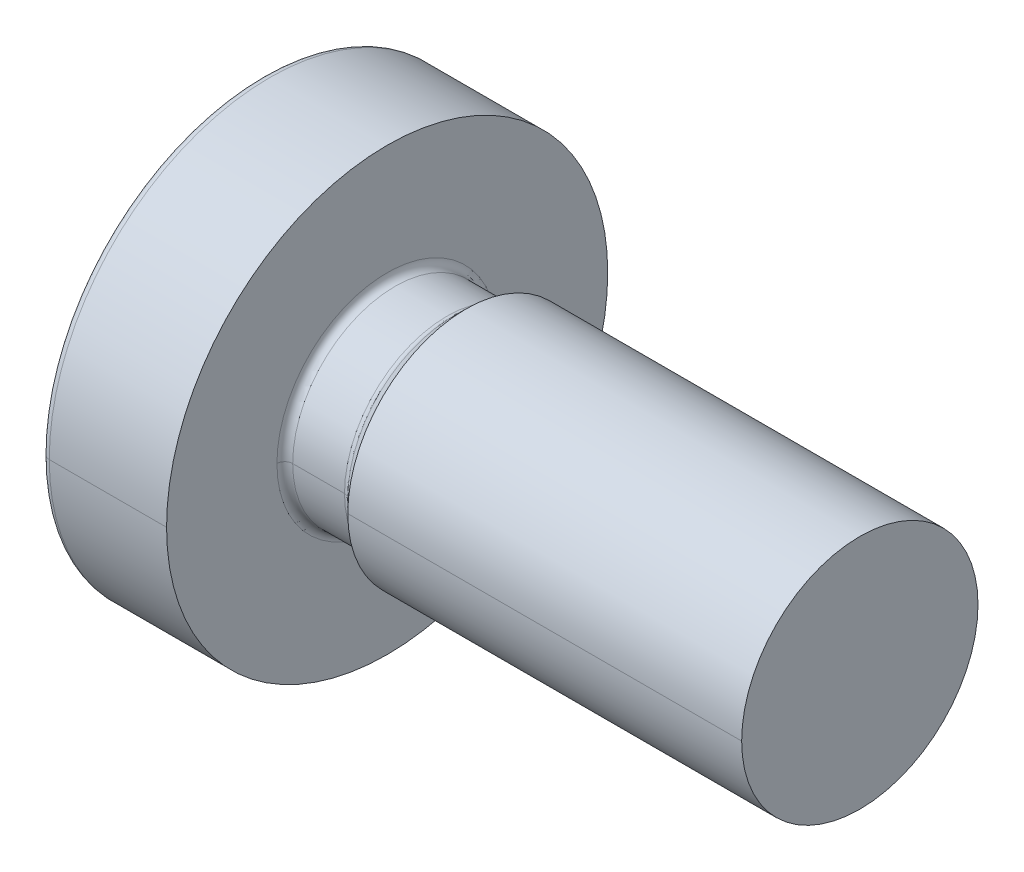
ISO-10303-21;
HEADER;
FILE_DESCRIPTION(('STEP AP214'),'2;1');
FILE_NAME('part.step','',(''),(''),'','','');
FILE_SCHEMA(('AUTOMOTIVE_DESIGN { 1 0 10303 214 1 1 1 1 }'));
ENDSEC;
DATA;
#1=APPLICATION_CONTEXT('core data for automotive mechanical design processes');
#2=APPLICATION_PROTOCOL_DEFINITION('international standard','automotive_design',2000,#1);
#3=PRODUCT_CONTEXT('',#1,'mechanical');
#4=PRODUCT('Part','Part','',(#3));
#5=PRODUCT_RELATED_PRODUCT_CATEGORY('part','',(#4));
#6=PRODUCT_DEFINITION_FORMATION('','',#4);
#7=PRODUCT_DEFINITION_CONTEXT('part definition',#1,'design');
#8=PRODUCT_DEFINITION('design','',#6,#7);
#9=PRODUCT_DEFINITION_SHAPE('','',#8);
#10=(LENGTH_UNIT() NAMED_UNIT(*) SI_UNIT(.MILLI.,.METRE.));
#11=(NAMED_UNIT(*) PLANE_ANGLE_UNIT() SI_UNIT($,.RADIAN.));
#12=(NAMED_UNIT(*) SI_UNIT($,.STERADIAN.) SOLID_ANGLE_UNIT());
#13=UNCERTAINTY_MEASURE_WITH_UNIT(LENGTH_MEASURE(1.E-05),#10,'distance_accuracy_value','');
#14=(GEOMETRIC_REPRESENTATION_CONTEXT(3) GLOBAL_UNCERTAINTY_ASSIGNED_CONTEXT((#13)) GLOBAL_UNIT_ASSIGNED_CONTEXT((#10,
#11,#12)) REPRESENTATION_CONTEXT('',''));
#15=CARTESIAN_POINT('',(0.,0.,0.));
#16=DIRECTION('',(0.,0.,1.));
#17=DIRECTION('',(1.,0.,0.));
#18=AXIS2_PLACEMENT_3D('',#15,#16,#17);
#19=CARTESIAN_POINT('',(2.5,0.,0.));
#20=DIRECTION('',(-1.,0.,0.));
#21=DIRECTION('',(0.,0.,1.));
#22=AXIS2_PLACEMENT_3D('',#19,#20,#21);
#23=TOROIDAL_SURFACE('',#22,1.399,0.1);
#24=CARTESIAN_POINT('',(2.4,0.,0.));
#25=DIRECTION('',(-1.,0.,0.));
#26=DIRECTION('',(0.,0.,1.));
#27=AXIS2_PLACEMENT_3D('',#24,#25,#26);
#28=CIRCLE('',#27,1.399);
#29=CARTESIAN_POINT('',(2.4,0.,-1.399));
#30=VERTEX_POINT('',#29);
#31=CARTESIAN_POINT('',(2.4,0.,1.399));
#32=VERTEX_POINT('',#31);
#33=EDGE_CURVE('E19',#30,#32,#28,.T.);
#34=ORIENTED_EDGE('',*,*,#33,.F.);
#35=CARTESIAN_POINT('',(2.5,0.,-1.399));
#36=DIRECTION('',(0.,1.,0.));
#37=DIRECTION('',(0.,0.,1.));
#38=AXIS2_PLACEMENT_3D('',#35,#36,#37);
#39=CIRCLE('',#38,0.1);
#40=CARTESIAN_POINT('',(2.5,0.,-1.299));
#41=VERTEX_POINT('',#40);
#42=EDGE_CURVE('E10',#30,#41,#39,.T.);
#43=ORIENTED_EDGE('',*,*,#42,.T.);
#44=CARTESIAN_POINT('',(2.5,0.,0.));
#45=DIRECTION('',(1.,0.,0.));
#46=DIRECTION('',(0.,0.,1.));
#47=AXIS2_PLACEMENT_3D('',#44,#45,#46);
#48=CIRCLE('',#47,1.299);
#49=CARTESIAN_POINT('',(2.5,0.,1.299));
#50=VERTEX_POINT('',#49);
#51=EDGE_CURVE('E279',#50,#41,#48,.T.);
#52=ORIENTED_EDGE('',*,*,#51,.F.);
#53=CARTESIAN_POINT('',(2.5,0.,1.399));
#54=DIRECTION('',(0.,-1.,0.));
#55=DIRECTION('',(0.,0.,-1.));
#56=AXIS2_PLACEMENT_3D('',#53,#54,#55);
#57=CIRCLE('',#56,0.1);
#58=EDGE_CURVE('E278',#32,#50,#57,.T.);
#59=ORIENTED_EDGE('',*,*,#58,.F.);
#60=EDGE_LOOP('',(#34,#43,#52,#59));
#61=FACE_BOUND('',#60,.T.);
#62=ADVANCED_FACE('F15',(#61),#23,.F.);
#63=CARTESIAN_POINT('',(3.15757864376269,0.,0.));
#64=DIRECTION('',(-1.,0.,0.));
#65=DIRECTION('',(0.,0.,1.));
#66=AXIS2_PLACEMENT_3D('',#63,#64,#65);
#67=TOROIDAL_SURFACE('',#66,1.399,0.1);
#68=CARTESIAN_POINT('',(3.15757864376269,0.,0.));
#69=DIRECTION('',(-1.,0.,0.));
#70=DIRECTION('',(0.,0.,1.));
#71=AXIS2_PLACEMENT_3D('',#68,#69,#70);
#72=CIRCLE('',#71,1.299);
#73=CARTESIAN_POINT('',(3.15757864376269,0.,-1.299));
#74=VERTEX_POINT('',#73);
#75=CARTESIAN_POINT('',(3.15757864376269,0.,1.299));
#76=VERTEX_POINT('',#75);
#77=EDGE_CURVE('E293',#74,#76,#72,.T.);
#78=ORIENTED_EDGE('',*,*,#77,.F.);
#79=CARTESIAN_POINT('',(3.15757864376269,0.,-1.399));
#80=DIRECTION('',(0.,1.,0.));
#81=DIRECTION('',(0.,0.,1.));
#82=AXIS2_PLACEMENT_3D('',#79,#80,#81);
#83=CIRCLE('',#82,0.1);
#84=CARTESIAN_POINT('',(3.22828932188134,0.,-1.32828932188134));
#85=VERTEX_POINT('',#84);
#86=EDGE_CURVE('E26',#74,#85,#83,.T.);
#87=ORIENTED_EDGE('',*,*,#86,.T.);
#88=CARTESIAN_POINT('',(3.22828932188134,0.,0.));
#89=DIRECTION('',(1.,0.,0.));
#90=DIRECTION('',(0.,0.,-1.));
#91=AXIS2_PLACEMENT_3D('',#88,#89,#90);
#92=CIRCLE('',#91,1.32828932188134);
#93=CARTESIAN_POINT('',(3.22828932188134,0.,1.32828932188134));
#94=VERTEX_POINT('',#93);
#95=EDGE_CURVE('E328',#94,#85,#92,.T.);
#96=ORIENTED_EDGE('',*,*,#95,.F.);
#97=CARTESIAN_POINT('',(3.15757864376269,0.,1.399));
#98=DIRECTION('',(0.,-1.,0.));
#99=DIRECTION('',(0.,0.,-1.));
#100=AXIS2_PLACEMENT_3D('',#97,#98,#99);
#101=CIRCLE('',#100,0.1);
#102=EDGE_CURVE('E285',#76,#94,#101,.T.);
#103=ORIENTED_EDGE('',*,*,#102,.F.);
#104=EDGE_LOOP('',(#78,#87,#96,#103));
#105=FACE_BOUND('',#104,.T.);
#106=ADVANCED_FACE('F870',(#105),#67,.F.);
#107=CARTESIAN_POINT('',(0.910990339947826,0.,0.));
#108=DIRECTION('',(1.,0.,0.));
#109=DIRECTION('',(0.,0.,-1.));
#110=AXIS2_PLACEMENT_3D('',#107,#108,#109);
#111=TOROIDAL_SURFACE('',#110,2.7,0.1);
#112=CARTESIAN_POINT('',(0.827541163212067,0.,0.));
#113=DIRECTION('',(-1.,0.,0.));
#114=DIRECTION('',(0.,0.,-1.));
#115=AXIS2_PLACEMENT_3D('',#112,#113,#114);
#116=CIRCLE('',#115,2.75510204081632);
#117=CARTESIAN_POINT('',(0.827541163212067,0.,2.75510204081632));
#118=VERTEX_POINT('',#117);
#119=CARTESIAN_POINT('',(0.827541163212066,2.75510204081632,0.));
#120=VERTEX_POINT('',#119);
#121=EDGE_CURVE('E169',#118,#120,#116,.T.);
#122=ORIENTED_EDGE('',*,*,#121,.F.);
#123=CARTESIAN_POINT('',(0.910990339947826,0.,2.7));
#124=DIRECTION('',(0.,1.,0.));
#125=DIRECTION('',(0.,0.,1.));
#126=AXIS2_PLACEMENT_3D('',#123,#124,#125);
#127=CIRCLE('',#126,0.1);
#128=CARTESIAN_POINT('',(0.910990339947826,0.,2.8));
#129=VERTEX_POINT('',#128);
#130=EDGE_CURVE('E461',#118,#129,#127,.T.);
#131=ORIENTED_EDGE('',*,*,#130,.T.);
#132=CARTESIAN_POINT('',(0.910990339947826,0.,0.));
#133=DIRECTION('',(1.,0.,0.));
#134=DIRECTION('',(0.,0.,-1.));
#135=AXIS2_PLACEMENT_3D('',#132,#133,#134);
#136=CIRCLE('',#135,2.8);
#137=CARTESIAN_POINT('',(0.910990339947826,0.,-2.8));
#138=VERTEX_POINT('',#137);
#139=EDGE_CURVE('E383',#138,#129,#136,.T.);
#140=ORIENTED_EDGE('',*,*,#139,.F.);
#141=CARTESIAN_POINT('',(0.910990339947826,0.,-2.7));
#142=DIRECTION('',(0.,-1.,0.));
#143=DIRECTION('',(0.,0.,-1.));
#144=AXIS2_PLACEMENT_3D('',#141,#142,#143);
#145=CIRCLE('',#144,0.1);
#146=CARTESIAN_POINT('',(0.827541163212067,0.,-2.75510204081632));
#147=VERTEX_POINT('',#146);
#148=EDGE_CURVE('E239',#147,#138,#145,.T.);
#149=ORIENTED_EDGE('',*,*,#148,.F.);
#150=CARTESIAN_POINT('',(0.827541163212067,0.,0.));
#151=DIRECTION('',(-1.,0.,0.));
#152=DIRECTION('',(0.,0.,-1.));
#153=AXIS2_PLACEMENT_3D('',#150,#151,#152);
#154=CIRCLE('',#153,2.75510204081632);
#155=EDGE_CURVE('E370',#120,#147,#154,.T.);
#156=ORIENTED_EDGE('',*,*,#155,.F.);
#157=EDGE_LOOP('',(#122,#131,#140,#149,#156));
#158=FACE_BOUND('',#157,.T.);
#159=ADVANCED_FACE('F781',(#158),#111,.T.);
#160=CARTESIAN_POINT('',(-3.4420013783492,0.,0.));
#161=DIRECTION('',(-1.,0.,0.));
#162=DIRECTION('',(0.,0.,1.));
#163=AXIS2_PLACEMENT_3D('',#160,#161,#162);
#164=CYLINDRICAL_SURFACE('',#163,1.5);
#165=CARTESIAN_POINT('',(8.4,0.,0.));
#166=DIRECTION('',(-1.,0.,0.));
#167=DIRECTION('',(0.,0.,1.));
#168=AXIS2_PLACEMENT_3D('',#165,#166,#167);
#169=CIRCLE('',#168,1.5);
#170=CARTESIAN_POINT('',(8.4,0.,1.5));
#171=VERTEX_POINT('',#170);
#172=CARTESIAN_POINT('',(8.4,0.,-1.5));
#173=VERTEX_POINT('',#172);
#174=EDGE_CURVE('E458',#171,#173,#169,.T.);
#175=ORIENTED_EDGE('',*,*,#174,.T.);
#176=DIRECTION('',(-1.,0.,0.));
#177=VECTOR('',#176,1.);
#178=CARTESIAN_POINT('',(-3.4420013783492,0.,-1.5));
#179=LINE('',#178,#177);
#180=CARTESIAN_POINT('',(3.4,0.,-1.5));
#181=VERTEX_POINT('',#180);
#182=EDGE_CURVE('E186',#173,#181,#179,.T.);
#183=ORIENTED_EDGE('',*,*,#182,.T.);
#184=CARTESIAN_POINT('',(3.4,0.,0.));
#185=DIRECTION('',(-1.,0.,0.));
#186=DIRECTION('',(0.,0.,1.));
#187=AXIS2_PLACEMENT_3D('',#184,#185,#186);
#188=CIRCLE('',#187,1.5);
#189=CARTESIAN_POINT('',(3.4,0.,1.5));
#190=VERTEX_POINT('',#189);
#191=EDGE_CURVE('E324',#190,#181,#188,.T.);
#192=ORIENTED_EDGE('',*,*,#191,.F.);
#193=DIRECTION('',(-1.,0.,0.));
#194=VECTOR('',#193,1.);
#195=CARTESIAN_POINT('',(-3.4420013783492,0.,1.5));
#196=LINE('',#195,#194);
#197=EDGE_CURVE('E469',#171,#190,#196,.T.);
#198=ORIENTED_EDGE('',*,*,#197,.F.);
#199=EDGE_LOOP('',(#175,#183,#192,#198));
#200=FACE_BOUND('',#199,.T.);
#201=ADVANCED_FACE('F775',(#200),#164,.T.);
#202=CARTESIAN_POINT('',(3.4,0.,0.));
#203=DIRECTION('',(1.,0.,0.));
#204=DIRECTION('',(0.,0.,-1.));
#205=AXIS2_PLACEMENT_3D('',#202,#203,#204);
#206=CONICAL_SURFACE('',#205,1.5,0.78539816339744);
#207=CARTESIAN_POINT('',(3.22828932188134,0.,0.));
#208=DIRECTION('',(1.,0.,0.));
#209=DIRECTION('',(0.,0.,-1.));
#210=AXIS2_PLACEMENT_3D('',#207,#208,#209);
#211=CIRCLE('',#210,1.32828932188134);
#212=EDGE_CURVE('E323',#85,#94,#211,.T.);
#213=ORIENTED_EDGE('',*,*,#212,.T.);
#214=DIRECTION('',(0.707106781186554,0.,0.707106781186541));
#215=VECTOR('',#214,1.);
#216=CARTESIAN_POINT('',(3.4,0.,1.5));
#217=LINE('',#216,#215);
#218=EDGE_CURVE('E319',#94,#190,#217,.T.);
#219=ORIENTED_EDGE('',*,*,#218,.T.);
#220=ORIENTED_EDGE('',*,*,#191,.T.);
#221=DIRECTION('',(0.707106781186554,0.,-0.707106781186541));
#222=VECTOR('',#221,1.);
#223=CARTESIAN_POINT('',(3.4,0.,-1.5));
#224=LINE('',#223,#222);
#225=EDGE_CURVE('E325',#85,#181,#224,.T.);
#226=ORIENTED_EDGE('',*,*,#225,.F.);
#227=EDGE_LOOP('',(#213,#219,#220,#226));
#228=FACE_BOUND('',#227,.T.);
#229=ADVANCED_FACE('F780',(#228),#206,.T.);
#230=CARTESIAN_POINT('',(-3.4420013783492,0.,0.));
#231=DIRECTION('',(-1.,0.,0.));
#232=DIRECTION('',(0.,0.,1.));
#233=AXIS2_PLACEMENT_3D('',#230,#231,#232);
#234=CYLINDRICAL_SURFACE('',#233,1.299);
#235=CARTESIAN_POINT('',(3.15757864376269,0.,0.));
#236=DIRECTION('',(-1.,0.,0.));
#237=DIRECTION('',(0.,0.,1.));
#238=AXIS2_PLACEMENT_3D('',#235,#236,#237);
#239=CIRCLE('',#238,1.299);
#240=EDGE_CURVE('E513',#76,#74,#239,.T.);
#241=ORIENTED_EDGE('',*,*,#240,.T.);
#242=DIRECTION('',(-1.,0.,0.));
#243=VECTOR('',#242,1.);
#244=CARTESIAN_POINT('',(-3.4420013783492,0.,-1.299));
#245=LINE('',#244,#243);
#246=EDGE_CURVE('E509',#74,#41,#245,.T.);
#247=ORIENTED_EDGE('',*,*,#246,.T.);
#248=CARTESIAN_POINT('',(2.5,0.,0.));
#249=DIRECTION('',(1.,0.,0.));
#250=DIRECTION('',(0.,0.,1.));
#251=AXIS2_PLACEMENT_3D('',#248,#249,#250);
#252=CIRCLE('',#251,1.299);
#253=EDGE_CURVE('E363',#41,#50,#252,.T.);
#254=ORIENTED_EDGE('',*,*,#253,.T.);
#255=DIRECTION('',(-1.,0.,0.));
#256=VECTOR('',#255,1.);
#257=CARTESIAN_POINT('',(-3.4420013783492,0.,1.299));
#258=LINE('',#257,#256);
#259=EDGE_CURVE('E342',#76,#50,#258,.T.);
#260=ORIENTED_EDGE('',*,*,#259,.F.);
#261=EDGE_LOOP('',(#241,#247,#254,#260));
#262=FACE_BOUND('',#261,.T.);
#263=ADVANCED_FACE('F907',(#262),#234,.T.);
#264=CARTESIAN_POINT('',(-3.4420013783492,0.,0.));
#265=DIRECTION('',(-1.,0.,0.));
#266=DIRECTION('',(0.,0.,1.));
#267=AXIS2_PLACEMENT_3D('',#264,#265,#266);
#268=CYLINDRICAL_SURFACE('',#267,2.8);
#269=CARTESIAN_POINT('',(2.4,0.,0.));
#270=DIRECTION('',(-1.,0.,0.));
#271=DIRECTION('',(0.,0.,1.));
#272=AXIS2_PLACEMENT_3D('',#269,#270,#271);
#273=CIRCLE('',#272,2.8);
#274=CARTESIAN_POINT('',(2.4,0.,2.8));
#275=VERTEX_POINT('',#274);
#276=CARTESIAN_POINT('',(2.4,0.,-2.8));
#277=VERTEX_POINT('',#276);
#278=EDGE_CURVE('E360',#275,#277,#273,.T.);
#279=ORIENTED_EDGE('',*,*,#278,.T.);
#280=DIRECTION('',(-1.,0.,0.));
#281=VECTOR('',#280,1.);
#282=CARTESIAN_POINT('',(-3.4420013783492,0.,-2.8));
#283=LINE('',#282,#281);
#284=EDGE_CURVE('E364',#277,#138,#283,.T.);
#285=ORIENTED_EDGE('',*,*,#284,.T.);
#286=ORIENTED_EDGE('',*,*,#139,.T.);
#287=DIRECTION('',(-1.,0.,0.));
#288=VECTOR('',#287,1.);
#289=CARTESIAN_POINT('',(-3.4420013783492,0.,2.8));
#290=LINE('',#289,#288);
#291=EDGE_CURVE('E251',#275,#129,#290,.T.);
#292=ORIENTED_EDGE('',*,*,#291,.F.);
#293=EDGE_LOOP('',(#279,#285,#286,#292));
#294=FACE_BOUND('',#293,.T.);
#295=ADVANCED_FACE('F912',(#294),#268,.T.);
#296=CARTESIAN_POINT('',(5.,0.,0.));
#297=DIRECTION('',(0.,0.,-1.));
#298=DIRECTION('',(0.,1.,0.));
#299=AXIS2_PLACEMENT_3D('',#296,#297,#298);
#300=SPHERICAL_SURFACE('',#299,5.);
#301=ORIENTED_EDGE('',*,*,#155,.T.);
#302=CARTESIAN_POINT('',(0.827541163212067,0.,0.));
#303=DIRECTION('',(-1.,0.,0.));
#304=DIRECTION('',(0.,0.,-1.));
#305=AXIS2_PLACEMENT_3D('',#302,#303,#304);
#306=CIRCLE('',#305,2.75510204081632);
#307=CARTESIAN_POINT('',(0.827541163212066,-2.75510204081632,0.));
#308=VERTEX_POINT('',#307);
#309=EDGE_CURVE('E366',#147,#308,#306,.T.);
#310=ORIENTED_EDGE('',*,*,#309,.T.);
#311=CARTESIAN_POINT('',(5.,0.,0.));
#312=DIRECTION('',(0.,0.,-1.));
#313=DIRECTION('',(0.,1.,0.));
#314=AXIS2_PLACEMENT_3D('',#311,#312,#313);
#315=CIRCLE('',#314,5.);
#316=CARTESIAN_POINT('',(0.0483882559325496,-0.693931650822548,0.));
#317=VERTEX_POINT('',#316);
#318=EDGE_CURVE('E371',#308,#317,#315,.T.);
#319=ORIENTED_EDGE('',*,*,#318,.T.);
#320=CARTESIAN_POINT('',(5.00907871968526,-0.073940238239228,0.0283829982019893));
#321=DIRECTION('',(0.113883497498907,-0.927506656060475,0.356036447517571));
#322=DIRECTION('',(0.,-0.358367949545293,-0.933580426497205));
#323=AXIS2_PLACEMENT_3D('',#320,#321,#322);
#324=CIRCLE('',#323,4.9993644419497);
#325=CARTESIAN_POINT('',(0.0743133377131422,-0.805315831954644,-0.298458231192017));
#326=VERTEX_POINT('',#325);
#327=EDGE_CURVE('E415',#317,#326,#324,.T.);
#328=ORIENTED_EDGE('',*,*,#327,.T.);
#329=CARTESIAN_POINT('',(4.99447111284247,0.0450291723721179,-0.0434841662986069));
#330=DIRECTION('',(0.0879813128153511,-0.716550290756221,0.691964572368025));
#331=DIRECTION('',(0.,-0.694658370458996,-0.719339800338653));
#332=AXIS2_PLACEMENT_3D('',#329,#330,#331);
#333=CIRCLE('',#332,4.99960507763599);
#334=CARTESIAN_POINT('',(0.212229293358308,-1.22830113216143,-0.754007950458526));
#335=VERTEX_POINT('',#334);
#336=EDGE_CURVE('E419',#326,#335,#333,.T.);
#337=ORIENTED_EDGE('',*,*,#336,.T.);
#338=CARTESIAN_POINT('',(4.60651618361134,0.558053223935769,0.55805322393577));
#339=DIRECTION('',(-0.446197814505031,0.632814155313759,0.63281415531376));
#340=DIRECTION('',(0.,-0.707106781186548,0.707106781186547));
#341=AXIS2_PLACEMENT_3D('',#338,#339,#340);
#342=CIRCLE('',#341,4.92161799459791);
#343=CARTESIAN_POINT('',(0.212229294438488,-0.754007950138534,-1.22830113171978));
#344=VERTEX_POINT('',#343);
#345=EDGE_CURVE('E378',#344,#335,#342,.T.);
#346=ORIENTED_EDGE('',*,*,#345,.F.);
#347=CARTESIAN_POINT('',(4.99447111284247,-0.0434841662986056,0.0450291723721165));
#348=DIRECTION('',(0.0879813128153507,0.691964572368025,-0.716550290756221));
#349=DIRECTION('',(0.,0.719339800338653,0.694658370458996));
#350=AXIS2_PLACEMENT_3D('',#347,#348,#349);
#351=CIRCLE('',#350,4.99960507763599);
#352=CARTESIAN_POINT('',(0.0743133377131075,-0.298458231192018,-0.805315831954648));
#353=VERTEX_POINT('',#352);
#354=EDGE_CURVE('E482',#344,#353,#351,.T.);
#355=ORIENTED_EDGE('',*,*,#354,.T.);
#356=CARTESIAN_POINT('',(5.00907871968526,0.0283829982019898,-0.0739402382392289));
#357=DIRECTION('',(0.113883497498906,0.356036447517571,-0.927506656060475));
#358=DIRECTION('',(0.,0.933580426497205,0.358367949545293));
#359=AXIS2_PLACEMENT_3D('',#356,#357,#358);
#360=CIRCLE('',#359,4.9993644419497);
#361=CARTESIAN_POINT('',(0.04838825593255,0.,-0.693931650822548));
#362=VERTEX_POINT('',#361);
#363=EDGE_CURVE('E354',#353,#362,#360,.T.);
#364=ORIENTED_EDGE('',*,*,#363,.T.);
#365=CARTESIAN_POINT('',(5.00907871968526,-0.0283829982019896,-0.0739402382392284));
#366=DIRECTION('',(0.113883497498906,-0.356036447517572,-0.927506656060475));
#367=DIRECTION('',(0.,0.933580426497204,-0.358367949545294));
#368=AXIS2_PLACEMENT_3D('',#365,#366,#367);
#369=CIRCLE('',#368,4.9993644419497);
#370=CARTESIAN_POINT('',(0.0743133377131416,0.298458231192017,-0.805315831954644));
#371=VERTEX_POINT('',#370);
#372=EDGE_CURVE('E350',#362,#371,#369,.T.);
#373=ORIENTED_EDGE('',*,*,#372,.T.);
#374=CARTESIAN_POINT('',(4.99447111284247,0.043484166298606,0.0450291723721169));
#375=DIRECTION('',(0.0879813128153509,-0.691964572368024,-0.716550290756221));
#376=DIRECTION('',(0.,0.719339800338653,-0.694658370458996));
#377=AXIS2_PLACEMENT_3D('',#374,#375,#376);
#378=CIRCLE('',#377,4.99960507763599);
#379=CARTESIAN_POINT('',(0.212229293358308,0.754007950458526,-1.22830113216143));
#380=VERTEX_POINT('',#379);
#381=EDGE_CURVE('E311',#371,#380,#378,.T.);
#382=ORIENTED_EDGE('',*,*,#381,.T.);
#383=CARTESIAN_POINT('',(4.60651618361134,-0.558053223935769,0.558053223935769));
#384=DIRECTION('',(-0.446197814505031,-0.63281415531376,0.63281415531376));
#385=DIRECTION('',(0.,-0.707106781186548,-0.707106781186547));
#386=AXIS2_PLACEMENT_3D('',#383,#384,#385);
#387=CIRCLE('',#386,4.92161799459791);
#388=CARTESIAN_POINT('',(0.212229293358308,1.22830113216143,-0.754007950458526));
#389=VERTEX_POINT('',#388);
#390=EDGE_CURVE('E317',#389,#380,#387,.T.);
#391=ORIENTED_EDGE('',*,*,#390,.F.);
#392=CARTESIAN_POINT('',(4.99447111284247,-0.0450291723721175,-0.0434841662986066));
#393=DIRECTION('',(0.087981312815351,0.716550290756221,0.691964572368025));
#394=DIRECTION('',(0.,-0.694658370458996,0.719339800338653));
#395=AXIS2_PLACEMENT_3D('',#392,#393,#394);
#396=CIRCLE('',#395,4.99960507763599);
#397=CARTESIAN_POINT('',(0.0743133377131069,0.805315831954649,-0.298458231192017));
#398=VERTEX_POINT('',#397);
#399=EDGE_CURVE('E307',#389,#398,#396,.T.);
#400=ORIENTED_EDGE('',*,*,#399,.T.);
#401=CARTESIAN_POINT('',(5.00907871968526,0.0739402382392284,0.0283829982019895));
#402=DIRECTION('',(0.113883497498906,0.927506656060475,0.356036447517571));
#403=DIRECTION('',(0.,-0.358367949545293,0.933580426497205));
#404=AXIS2_PLACEMENT_3D('',#401,#402,#403);
#405=CIRCLE('',#404,4.9993644419497);
#406=CARTESIAN_POINT('',(0.0483882559325506,0.693931650822548,0.));
#407=VERTEX_POINT('',#406);
#408=EDGE_CURVE('E312',#398,#407,#405,.T.);
#409=ORIENTED_EDGE('',*,*,#408,.T.);
#410=CARTESIAN_POINT('',(5.,0.,0.));
#411=DIRECTION('',(0.,0.,1.));
#412=DIRECTION('',(1.,0.,0.));
#413=AXIS2_PLACEMENT_3D('',#410,#411,#412);
#414=CIRCLE('',#413,5.);
#415=EDGE_CURVE('E346',#120,#407,#414,.T.);
#416=ORIENTED_EDGE('',*,*,#415,.F.);
#417=EDGE_LOOP('',(#301,#310,#319,#328,#337,#346,#355,#364,#373,#382,#391,#400,#409,#416));
#418=FACE_BOUND('',#417,.T.);
#419=ADVANCED_FACE('F596',(#418),#300,.T.);
#420=CARTESIAN_POINT('',(5.,0.,0.));
#421=DIRECTION('',(0.,0.,-1.));
#422=DIRECTION('',(0.,1.,0.));
#423=AXIS2_PLACEMENT_3D('',#420,#421,#422);
#424=SPHERICAL_SURFACE('',#423,5.);
#425=ORIENTED_EDGE('',*,*,#318,.F.);
#426=CARTESIAN_POINT('',(0.827541163212067,0.,0.));
#427=DIRECTION('',(-1.,0.,0.));
#428=DIRECTION('',(0.,0.,-1.));
#429=AXIS2_PLACEMENT_3D('',#426,#427,#428);
#430=CIRCLE('',#429,2.75510204081632);
#431=EDGE_CURVE('E345',#308,#118,#430,.T.);
#432=ORIENTED_EDGE('',*,*,#431,.T.);
#433=ORIENTED_EDGE('',*,*,#121,.T.);
#434=ORIENTED_EDGE('',*,*,#415,.T.);
#435=CARTESIAN_POINT('',(5.00907871968526,0.0739402382392284,-0.0283829982019895));
#436=DIRECTION('',(0.113883497498906,0.927506656060475,-0.356036447517571));
#437=DIRECTION('',(0.,0.358367949545293,0.933580426497205));
#438=AXIS2_PLACEMENT_3D('',#435,#436,#437);
#439=CIRCLE('',#438,4.9993644419497);
#440=CARTESIAN_POINT('',(0.0743133377131422,0.805315831954644,0.298458231192017));
#441=VERTEX_POINT('',#440);
#442=EDGE_CURVE('E374',#407,#441,#439,.T.);
#443=ORIENTED_EDGE('',*,*,#442,.T.);
#444=CARTESIAN_POINT('',(4.99447111284247,-0.0450291723721173,0.0434841662986063));
#445=DIRECTION('',(0.0879813128153509,0.716550290756221,-0.691964572368025));
#446=DIRECTION('',(0.,0.694658370458996,0.719339800338653));
#447=AXIS2_PLACEMENT_3D('',#444,#445,#446);
#448=CIRCLE('',#447,4.99960507763599);
#449=CARTESIAN_POINT('',(0.212229293358308,1.22830113216143,0.754007950458526));
#450=VERTEX_POINT('',#449);
#451=EDGE_CURVE('E466',#441,#450,#448,.T.);
#452=ORIENTED_EDGE('',*,*,#451,.T.);
#453=CARTESIAN_POINT('',(4.60651618361134,-0.558053223935769,-0.55805322393577));
#454=DIRECTION('',(-0.446197814505031,-0.63281415531376,-0.63281415531376));
#455=DIRECTION('',(0.,0.707106781186548,-0.707106781186547));
#456=AXIS2_PLACEMENT_3D('',#453,#454,#455);
#457=CIRCLE('',#456,4.92161799459792);
#458=CARTESIAN_POINT('',(0.212229294438488,0.754007950138533,1.22830113171978));
#459=VERTEX_POINT('',#458);
#460=EDGE_CURVE('E358',#459,#450,#457,.T.);
#461=ORIENTED_EDGE('',*,*,#460,.F.);
#462=CARTESIAN_POINT('',(4.99447111284247,0.043484166298606,-0.0450291723721169));
#463=DIRECTION('',(0.0879813128153509,-0.691964572368024,0.716550290756221));
#464=DIRECTION('',(0.,-0.719339800338653,-0.694658370458996));
#465=AXIS2_PLACEMENT_3D('',#462,#463,#464);
#466=CIRCLE('',#465,4.99960507763599);
#467=CARTESIAN_POINT('',(0.0743133377131075,0.298458231192017,0.805315831954648));
#468=VERTEX_POINT('',#467);
#469=EDGE_CURVE('E462',#459,#468,#466,.T.);
#470=ORIENTED_EDGE('',*,*,#469,.T.);
#471=CARTESIAN_POINT('',(5.00907871968526,-0.0283829982019896,0.0739402382392284));
#472=DIRECTION('',(0.113883497498906,-0.356036447517572,0.927506656060475));
#473=DIRECTION('',(0.,-0.933580426497204,-0.358367949545294));
#474=AXIS2_PLACEMENT_3D('',#471,#472,#473);
#475=CIRCLE('',#474,4.9993644419497);
#476=CARTESIAN_POINT('',(0.0483882559325501,0.,0.693931650822548));
#477=VERTEX_POINT('',#476);
#478=EDGE_CURVE('E349',#468,#477,#475,.T.);
#479=ORIENTED_EDGE('',*,*,#478,.T.);
#480=CARTESIAN_POINT('',(5.00907871968526,0.0283829982019898,0.0739402382392289));
#481=DIRECTION('',(0.113883497498906,0.356036447517571,0.927506656060475));
#482=DIRECTION('',(0.,-0.933580426497205,0.358367949545293));
#483=AXIS2_PLACEMENT_3D('',#480,#481,#482);
#484=CIRCLE('',#483,4.9993644419497);
#485=CARTESIAN_POINT('',(0.0743133377131421,-0.298458231192018,0.805315831954644));
#486=VERTEX_POINT('',#485);
#487=EDGE_CURVE('E120',#477,#486,#484,.T.);
#488=ORIENTED_EDGE('',*,*,#487,.T.);
#489=CARTESIAN_POINT('',(4.99447111284247,-0.0434841662986054,-0.0450291723721164));
#490=DIRECTION('',(0.0879813128153507,0.691964572368024,0.716550290756221));
#491=DIRECTION('',(0.,-0.719339800338653,0.694658370458996));
#492=AXIS2_PLACEMENT_3D('',#489,#490,#491);
#493=CIRCLE('',#492,4.99960507763599);
#494=CARTESIAN_POINT('',(0.212229293358308,-0.754007950458526,1.22830113216143));
#495=VERTEX_POINT('',#494);
#496=EDGE_CURVE('E136',#486,#495,#493,.T.);
#497=ORIENTED_EDGE('',*,*,#496,.T.);
#498=CARTESIAN_POINT('',(4.60651618361134,0.558053223935768,-0.558053223935769));
#499=DIRECTION('',(-0.446197814505031,0.632814155313759,-0.63281415531376));
#500=DIRECTION('',(0.,0.707106781186548,0.707106781186547));
#501=AXIS2_PLACEMENT_3D('',#498,#499,#500);
#502=CIRCLE('',#501,4.92161799459792);
#503=CARTESIAN_POINT('',(0.212229294438489,-1.22830113171978,0.754007950138533));
#504=VERTEX_POINT('',#503);
#505=EDGE_CURVE('E333',#504,#495,#502,.T.);
#506=ORIENTED_EDGE('',*,*,#505,.F.);
#507=CARTESIAN_POINT('',(4.99447111284247,0.0450291723721179,0.0434841662986069));
#508=DIRECTION('',(0.0879813128153511,-0.716550290756221,-0.691964572368025));
#509=DIRECTION('',(0.,0.694658370458996,-0.719339800338653));
#510=AXIS2_PLACEMENT_3D('',#507,#508,#509);
#511=CIRCLE('',#510,4.99960507763599);
#512=CARTESIAN_POINT('',(0.0743133377131069,-0.805315831954648,0.298458231192017));
#513=VERTEX_POINT('',#512);
#514=EDGE_CURVE('E454',#504,#513,#511,.T.);
#515=ORIENTED_EDGE('',*,*,#514,.T.);
#516=CARTESIAN_POINT('',(5.00907871968526,-0.0739402382392281,-0.0283829982019894));
#517=DIRECTION('',(0.113883497498907,-0.927506656060475,-0.356036447517571));
#518=DIRECTION('',(0.,0.358367949545293,-0.933580426497205));
#519=AXIS2_PLACEMENT_3D('',#516,#517,#518);
#520=CIRCLE('',#519,4.9993644419497);
#521=EDGE_CURVE('E533',#513,#317,#520,.T.);
#522=ORIENTED_EDGE('',*,*,#521,.T.);
#523=EDGE_LOOP('',(#425,#432,#433,#434,#443,#452,#461,#470,#479,#488,#497,#506,#515,#522));
#524=FACE_BOUND('',#523,.T.);
#525=ADVANCED_FACE('F948',(#524),#424,.T.);
#526=CARTESIAN_POINT('',(-3.4420013783492,0.,0.));
#527=DIRECTION('',(-1.,0.,0.));
#528=DIRECTION('',(0.,0.,1.));
#529=AXIS2_PLACEMENT_3D('',#526,#527,#528);
#530=CYLINDRICAL_SURFACE('',#529,2.8);
#531=ORIENTED_EDGE('',*,*,#284,.F.);
#532=CARTESIAN_POINT('',(2.4,0.,0.));
#533=DIRECTION('',(-1.,0.,0.));
#534=DIRECTION('',(0.,0.,1.));
#535=AXIS2_PLACEMENT_3D('',#532,#533,#534);
#536=CIRCLE('',#535,2.8);
#537=EDGE_CURVE('E505',#277,#275,#536,.T.);
#538=ORIENTED_EDGE('',*,*,#537,.T.);
#539=ORIENTED_EDGE('',*,*,#291,.T.);
#540=CARTESIAN_POINT('',(0.910990339947826,0.,0.));
#541=DIRECTION('',(1.,0.,0.));
#542=DIRECTION('',(0.,0.,-1.));
#543=AXIS2_PLACEMENT_3D('',#540,#541,#542);
#544=CIRCLE('',#543,2.8);
#545=EDGE_CURVE('E296',#129,#138,#544,.T.);
#546=ORIENTED_EDGE('',*,*,#545,.T.);
#547=EDGE_LOOP('',(#531,#538,#539,#546));
#548=FACE_BOUND('',#547,.T.);
#549=ADVANCED_FACE('F953',(#548),#530,.T.);
#550=CARTESIAN_POINT('',(2.4,2.8,0.));
#551=DIRECTION('',(-1.,0.,0.));
#552=DIRECTION('',(0.,0.,1.));
#553=AXIS2_PLACEMENT_3D('',#550,#551,#552);
#554=PLANE('',#553);
#555=ORIENTED_EDGE('',*,*,#278,.F.);
#556=ORIENTED_EDGE('',*,*,#537,.F.);
#557=EDGE_LOOP('',(#555,#556));
#558=FACE_BOUND('',#557,.T.);
#559=CARTESIAN_POINT('',(2.4,0.,0.));
#560=DIRECTION('',(-1.,0.,0.));
#561=DIRECTION('',(0.,0.,1.));
#562=AXIS2_PLACEMENT_3D('',#559,#560,#561);
#563=CIRCLE('',#562,1.399);
#564=EDGE_CURVE('E291',#32,#30,#563,.T.);
#565=ORIENTED_EDGE('',*,*,#564,.T.);
#566=ORIENTED_EDGE('',*,*,#33,.T.);
#567=EDGE_LOOP('',(#565,#566));
#568=FACE_BOUND('',#567,.T.);
#569=ADVANCED_FACE('F290',(#558,#568),#554,.F.);
#570=CARTESIAN_POINT('',(-3.4420013783492,0.,0.));
#571=DIRECTION('',(-1.,0.,0.));
#572=DIRECTION('',(0.,0.,1.));
#573=AXIS2_PLACEMENT_3D('',#570,#571,#572);
#574=CYLINDRICAL_SURFACE('',#573,1.299);
#575=ORIENTED_EDGE('',*,*,#246,.F.);
#576=ORIENTED_EDGE('',*,*,#77,.T.);
#577=ORIENTED_EDGE('',*,*,#259,.T.);
#578=ORIENTED_EDGE('',*,*,#51,.T.);
#579=EDGE_LOOP('',(#575,#576,#577,#578));
#580=FACE_BOUND('',#579,.T.);
#581=ADVANCED_FACE('F962',(#580),#574,.T.);
#582=CARTESIAN_POINT('',(3.4,0.,0.));
#583=DIRECTION('',(1.,0.,0.));
#584=DIRECTION('',(0.,0.,-1.));
#585=AXIS2_PLACEMENT_3D('',#582,#583,#584);
#586=CONICAL_SURFACE('',#585,1.5,0.78539816339744);
#587=ORIENTED_EDGE('',*,*,#218,.F.);
#588=ORIENTED_EDGE('',*,*,#95,.T.);
#589=ORIENTED_EDGE('',*,*,#225,.T.);
#590=CARTESIAN_POINT('',(3.4,0.,0.));
#591=DIRECTION('',(-1.,0.,0.));
#592=DIRECTION('',(0.,0.,1.));
#593=AXIS2_PLACEMENT_3D('',#590,#591,#592);
#594=CIRCLE('',#593,1.5);
#595=EDGE_CURVE('E329',#181,#190,#594,.T.);
#596=ORIENTED_EDGE('',*,*,#595,.T.);
#597=EDGE_LOOP('',(#587,#588,#589,#596));
#598=FACE_BOUND('',#597,.T.);
#599=ADVANCED_FACE('F795',(#598),#586,.T.);
#600=CARTESIAN_POINT('',(-3.4420013783492,0.,0.));
#601=DIRECTION('',(-1.,0.,0.));
#602=DIRECTION('',(0.,0.,1.));
#603=AXIS2_PLACEMENT_3D('',#600,#601,#602);
#604=CYLINDRICAL_SURFACE('',#603,1.5);
#605=ORIENTED_EDGE('',*,*,#182,.F.);
#606=CARTESIAN_POINT('',(8.4,0.,0.));
#607=DIRECTION('',(-1.,0.,0.));
#608=DIRECTION('',(0.,0.,1.));
#609=AXIS2_PLACEMENT_3D('',#606,#607,#608);
#610=CIRCLE('',#609,1.5);
#611=EDGE_CURVE('E439',#173,#171,#610,.T.);
#612=ORIENTED_EDGE('',*,*,#611,.T.);
#613=ORIENTED_EDGE('',*,*,#197,.T.);
#614=ORIENTED_EDGE('',*,*,#595,.F.);
#615=EDGE_LOOP('',(#605,#612,#613,#614));
#616=FACE_BOUND('',#615,.T.);
#617=ADVANCED_FACE('F791',(#616),#604,.T.);
#618=CARTESIAN_POINT('',(8.4,0.,0.));
#619=DIRECTION('',(-1.,0.,0.));
#620=DIRECTION('',(0.,0.,1.));
#621=AXIS2_PLACEMENT_3D('',#618,#619,#620);
#622=PLANE('',#621);
#623=ORIENTED_EDGE('',*,*,#174,.F.);
#624=ORIENTED_EDGE('',*,*,#611,.F.);
#625=EDGE_LOOP('',(#623,#624));
#626=FACE_BOUND('',#625,.T.);
#627=ADVANCED_FACE('F17',(#626),#622,.F.);
#628=CARTESIAN_POINT('',(0.910990339947826,0.,0.));
#629=DIRECTION('',(1.,0.,0.));
#630=DIRECTION('',(0.,0.,-1.));
#631=AXIS2_PLACEMENT_3D('',#628,#629,#630);
#632=TOROIDAL_SURFACE('',#631,2.7,0.1);
#633=ORIENTED_EDGE('',*,*,#130,.F.);
#634=ORIENTED_EDGE('',*,*,#431,.F.);
#635=ORIENTED_EDGE('',*,*,#309,.F.);
#636=ORIENTED_EDGE('',*,*,#148,.T.);
#637=ORIENTED_EDGE('',*,*,#545,.F.);
#638=EDGE_LOOP('',(#633,#634,#635,#636,#637));
#639=FACE_BOUND('',#638,.T.);
#640=ADVANCED_FACE('F1099',(#639),#632,.T.);
#641=CARTESIAN_POINT('',(3.15757864376269,0.,0.));
#642=DIRECTION('',(-1.,0.,0.));
#643=DIRECTION('',(0.,0.,1.));
#644=AXIS2_PLACEMENT_3D('',#641,#642,#643);
#645=TOROIDAL_SURFACE('',#644,1.399,0.1);
#646=ORIENTED_EDGE('',*,*,#86,.F.);
#647=ORIENTED_EDGE('',*,*,#240,.F.);
#648=ORIENTED_EDGE('',*,*,#102,.T.);
#649=ORIENTED_EDGE('',*,*,#212,.F.);
#650=EDGE_LOOP('',(#646,#647,#648,#649));
#651=FACE_BOUND('',#650,.T.);
#652=ADVANCED_FACE('F1094',(#651),#645,.F.);
#653=CARTESIAN_POINT('',(2.5,0.,0.));
#654=DIRECTION('',(-1.,0.,0.));
#655=DIRECTION('',(0.,0.,1.));
#656=AXIS2_PLACEMENT_3D('',#653,#654,#655);
#657=TOROIDAL_SURFACE('',#656,1.399,0.1);
#658=ORIENTED_EDGE('',*,*,#42,.F.);
#659=ORIENTED_EDGE('',*,*,#564,.F.);
#660=ORIENTED_EDGE('',*,*,#58,.T.);
#661=ORIENTED_EDGE('',*,*,#253,.F.);
#662=EDGE_LOOP('',(#658,#659,#660,#661));
#663=FACE_BOUND('',#662,.T.);
#664=ADVANCED_FACE('F294',(#663),#657,.F.);
#665=CARTESIAN_POINT('',(0.,1.31507331423074,-0.816878828796849));
#666=DIRECTION('',(0.087981312815351,0.716550290756221,0.691964572368024));
#667=DIRECTION('',(0.992013508213441,0.,-0.126131675332015));
#668=AXIS2_PLACEMENT_3D('',#665,#666,#667);
#669=PLANE('',#668);
#670=DIRECTION('',(-0.892670261136446,0.364977639050131,-0.264444942995667));
#671=VECTOR('',#670,1.);
#672=CARTESIAN_POINT('',(0.875,0.95732034757282,-0.557668529994433));
#673=LINE('',#672,#671);
#674=CARTESIAN_POINT('',(1.75,0.599567380914899,-0.298458231192017));
#675=VERTEX_POINT('',#674);
#676=EDGE_CURVE('E426',#675,#389,#673,.T.);
#677=ORIENTED_EDGE('',*,*,#676,.F.);
#678=DIRECTION('',(0.992546151641322,-0.121869343405147,0.));
#679=VECTOR('',#678,1.);
#680=CARTESIAN_POINT('',(0.875,0.70700387170494,-0.298458231192017));
#681=LINE('',#680,#679);
#682=EDGE_CURVE('E286',#398,#675,#681,.T.);
#683=ORIENTED_EDGE('',*,*,#682,.F.);
#684=ORIENTED_EDGE('',*,*,#399,.F.);
#685=EDGE_LOOP('',(#677,#683,#684));
#686=FACE_BOUND('',#685,.T.);
#687=ADVANCED_FACE('F826',(#686),#669,.F.);
#688=CARTESIAN_POINT('',(0.,0.699872981580083,0.));
#689=DIRECTION('',(0.113883497498906,0.927506656060475,0.356036447517571));
#690=DIRECTION('',(0.952461542619365,0.,-0.304658841708457));
#691=AXIS2_PLACEMENT_3D('',#688,#689,#690);
#692=PLANE('',#691);
#693=ORIENTED_EDGE('',*,*,#682,.T.);
#694=DIRECTION('',(0.,-0.358367949545295,0.933580426497204));
#695=VECTOR('',#694,1.);
#696=CARTESIAN_POINT('',(1.75,0.485,0.));
#697=LINE('',#696,#695);
#698=CARTESIAN_POINT('',(1.75,0.485,0.));
#699=VERTEX_POINT('',#698);
#700=EDGE_CURVE('E470',#675,#699,#697,.T.);
#701=ORIENTED_EDGE('',*,*,#700,.T.);
#702=DIRECTION('',(0.992546151641322,-0.121869343405147,0.));
#703=VECTOR('',#702,1.);
#704=CARTESIAN_POINT('',(0.,0.699872981580083,0.));
#705=LINE('',#704,#703);
#706=EDGE_CURVE('E423',#407,#699,#705,.T.);
#707=ORIENTED_EDGE('',*,*,#706,.F.);
#708=ORIENTED_EDGE('',*,*,#408,.F.);
#709=EDGE_LOOP('',(#693,#701,#707,#708));
#710=FACE_BOUND('',#709,.T.);
#711=ADVANCED_FACE('F821',(#710),#692,.F.);
#712=CARTESIAN_POINT('',(1.75,0.599567380914899,-0.298458231192017));
#713=DIRECTION('',(-0.446197814505031,-0.632814155313759,0.63281415531376));
#714=DIRECTION('',(-0.817268653268361,0.576256842375794,0.));
#715=AXIS2_PLACEMENT_3D('',#712,#713,#714);
#716=PLANE('',#715);
#717=ORIENTED_EDGE('',*,*,#390,.T.);
#718=DIRECTION('',(0.892670261136446,-0.264444942995668,0.364977639050131));
#719=VECTOR('',#718,1.);
#720=CARTESIAN_POINT('',(0.875,0.557668529994433,-0.95732034757282));
#721=LINE('',#720,#719);
#722=CARTESIAN_POINT('',(1.75,0.298458231192017,-0.599567380914899));
#723=VERTEX_POINT('',#722);
#724=EDGE_CURVE('E313',#380,#723,#721,.T.);
#725=ORIENTED_EDGE('',*,*,#724,.T.);
#726=DIRECTION('',(0.,0.707106781186548,0.707106781186547));
#727=VECTOR('',#726,1.);
#728=CARTESIAN_POINT('',(1.75,0.599567380914899,-0.298458231192017));
#729=LINE('',#728,#727);
#730=EDGE_CURVE('E318',#723,#675,#729,.T.);
#731=ORIENTED_EDGE('',*,*,#730,.T.);
#732=ORIENTED_EDGE('',*,*,#676,.T.);
#733=EDGE_LOOP('',(#717,#725,#731,#732));
#734=FACE_BOUND('',#733,.T.);
#735=ADVANCED_FACE('F825',(#734),#716,.T.);
#736=CARTESIAN_POINT('',(0.,0.699872981580083,0.));
#737=DIRECTION('',(0.113883497498906,0.927506656060475,-0.356036447517571));
#738=DIRECTION('',(-0.952461542619365,0.,-0.304658841708457));
#739=AXIS2_PLACEMENT_3D('',#736,#737,#738);
#740=PLANE('',#739);
#741=ORIENTED_EDGE('',*,*,#706,.T.);
#742=DIRECTION('',(0.,0.358367949545295,0.933580426497204));
#743=VECTOR('',#742,1.);
#744=CARTESIAN_POINT('',(1.75,0.485,0.));
#745=LINE('',#744,#743);
#746=CARTESIAN_POINT('',(1.75,0.599567380914899,0.298458231192017));
#747=VERTEX_POINT('',#746);
#748=EDGE_CURVE('E427',#699,#747,#745,.T.);
#749=ORIENTED_EDGE('',*,*,#748,.T.);
#750=DIRECTION('',(0.992546151641322,-0.121869343405147,0.));
#751=VECTOR('',#750,1.);
#752=CARTESIAN_POINT('',(0.,0.814440362494981,0.298458231192017));
#753=LINE('',#752,#751);
#754=EDGE_CURVE('E431',#441,#747,#753,.T.);
#755=ORIENTED_EDGE('',*,*,#754,.F.);
#756=ORIENTED_EDGE('',*,*,#442,.F.);
#757=EDGE_LOOP('',(#741,#749,#755,#756));
#758=FACE_BOUND('',#757,.T.);
#759=ADVANCED_FACE('F837',(#758),#740,.F.);
#760=CARTESIAN_POINT('',(0.,0.814440362494981,0.298458231192017));
#761=DIRECTION('',(0.087981312815351,0.716550290756221,-0.691964572368025));
#762=DIRECTION('',(-0.992013508213441,0.,-0.126131675332015));
#763=AXIS2_PLACEMENT_3D('',#760,#761,#762);
#764=PLANE('',#763);
#765=ORIENTED_EDGE('',*,*,#754,.T.);
#766=DIRECTION('',(0.892670261136446,-0.364977639050131,-0.264444942995668));
#767=VECTOR('',#766,1.);
#768=CARTESIAN_POINT('',(0.875,0.95732034757282,0.557668529994433));
#769=LINE('',#768,#767);
#770=EDGE_CURVE('E355',#450,#747,#769,.T.);
#771=ORIENTED_EDGE('',*,*,#770,.F.);
#772=ORIENTED_EDGE('',*,*,#451,.F.);
#773=EDGE_LOOP('',(#765,#771,#772));
#774=FACE_BOUND('',#773,.T.);
#775=ADVANCED_FACE('F882',(#774),#764,.F.);
#776=CARTESIAN_POINT('',(1.75,0.298458231192017,0.599567380914899));
#777=DIRECTION('',(-0.446197814505031,-0.632814155313759,-0.63281415531376));
#778=DIRECTION('',(0.,-0.707106781186548,0.707106781186547));
#779=AXIS2_PLACEMENT_3D('',#776,#777,#778);
#780=PLANE('',#779);
#781=ORIENTED_EDGE('',*,*,#460,.T.);
#782=ORIENTED_EDGE('',*,*,#770,.T.);
#783=DIRECTION('',(0.,-0.707106781186548,0.707106781186547));
#784=VECTOR('',#783,1.);
#785=CARTESIAN_POINT('',(1.75,0.599567380914899,0.298458231192017));
#786=LINE('',#785,#784);
#787=CARTESIAN_POINT('',(1.75,0.298458231192017,0.599567380914899));
#788=VERTEX_POINT('',#787);
#789=EDGE_CURVE('E359',#747,#788,#786,.T.);
#790=ORIENTED_EDGE('',*,*,#789,.T.);
#791=DIRECTION('',(-0.892670261136446,0.264444942995668,0.364977639050131));
#792=VECTOR('',#791,1.);
#793=CARTESIAN_POINT('',(0.875,0.557668529994433,0.95732034757282));
#794=LINE('',#793,#792);
#795=EDGE_CURVE('E477',#788,#459,#794,.T.);
#796=ORIENTED_EDGE('',*,*,#795,.T.);
#797=EDGE_LOOP('',(#781,#782,#790,#796));
#798=FACE_BOUND('',#797,.T.);
#799=ADVANCED_FACE('F878',(#798),#780,.T.);
#800=CARTESIAN_POINT('',(0.,0.816878828796849,1.31507331423074));
#801=DIRECTION('',(0.0879813128153509,-0.691964572368024,0.716550290756221));
#802=DIRECTION('',(-0.992013508213441,-0.126131675332015,0.));
#803=AXIS2_PLACEMENT_3D('',#800,#801,#802);
#804=PLANE('',#803);
#805=ORIENTED_EDGE('',*,*,#795,.F.);
#806=DIRECTION('',(0.992546151641322,0.,-0.121869343405147));
#807=VECTOR('',#806,1.);
#808=CARTESIAN_POINT('',(0.875,0.298458231192017,0.70700387170494));
#809=LINE('',#808,#807);
#810=EDGE_CURVE('E481',#468,#788,#809,.T.);
#811=ORIENTED_EDGE('',*,*,#810,.F.);
#812=ORIENTED_EDGE('',*,*,#469,.F.);
#813=EDGE_LOOP('',(#805,#811,#812));
#814=FACE_BOUND('',#813,.T.);
#815=ADVANCED_FACE('F881',(#814),#804,.F.);
#816=CARTESIAN_POINT('',(0.,0.,0.699872981580083));
#817=DIRECTION('',(0.113883497498906,-0.356036447517572,0.927506656060475));
#818=DIRECTION('',(-0.952461542619366,-0.304658841708457,0.));
#819=AXIS2_PLACEMENT_3D('',#816,#817,#818);
#820=PLANE('',#819);
#821=ORIENTED_EDGE('',*,*,#810,.T.);
#822=DIRECTION('',(0.,-0.933580426497203,-0.358367949545296));
#823=VECTOR('',#822,1.);
#824=CARTESIAN_POINT('',(1.75,0.,0.485));
#825=LINE('',#824,#823);
#826=CARTESIAN_POINT('',(1.75,0.,0.485));
#827=VERTEX_POINT('',#826);
#828=EDGE_CURVE('E502',#788,#827,#825,.T.);
#829=ORIENTED_EDGE('',*,*,#828,.T.);
#830=DIRECTION('',(0.992546151641322,0.,-0.121869343405147));
#831=VECTOR('',#830,1.);
#832=CARTESIAN_POINT('',(0.,0.,0.699872981580083));
#833=LINE('',#832,#831);
#834=EDGE_CURVE('E435',#477,#827,#833,.T.);
#835=ORIENTED_EDGE('',*,*,#834,.F.);
#836=ORIENTED_EDGE('',*,*,#478,.F.);
#837=EDGE_LOOP('',(#821,#829,#835,#836));
#838=FACE_BOUND('',#837,.T.);
#839=ADVANCED_FACE('F986',(#838),#820,.F.);
#840=CARTESIAN_POINT('',(0.,0.,0.699872981580083));
#841=DIRECTION('',(0.113883497498906,0.356036447517571,0.927506656060475));
#842=DIRECTION('',(0.952461542619366,-0.304658841708457,0.));
#843=AXIS2_PLACEMENT_3D('',#840,#841,#842);
#844=PLANE('',#843);
#845=ORIENTED_EDGE('',*,*,#834,.T.);
#846=DIRECTION('',(0.,-0.933580426497203,0.358367949545296));
#847=VECTOR('',#846,1.);
#848=CARTESIAN_POINT('',(1.75,0.,0.485));
#849=LINE('',#848,#847);
#850=CARTESIAN_POINT('',(1.75,-0.298458231192017,0.599567380914899));
#851=VERTEX_POINT('',#850);
#852=EDGE_CURVE('E398',#827,#851,#849,.T.);
#853=ORIENTED_EDGE('',*,*,#852,.T.);
#854=DIRECTION('',(0.992546151641322,0.,-0.121869343405147));
#855=VECTOR('',#854,1.);
#856=CARTESIAN_POINT('',(0.,-0.298458231192018,0.814440362494981));
#857=LINE('',#856,#855);
#858=EDGE_CURVE('E395',#486,#851,#857,.T.);
#859=ORIENTED_EDGE('',*,*,#858,.F.);
#860=ORIENTED_EDGE('',*,*,#487,.F.);
#861=EDGE_LOOP('',(#845,#853,#859,#860));
#862=FACE_BOUND('',#861,.T.);
#863=ADVANCED_FACE('F850',(#862),#844,.F.);
#864=CARTESIAN_POINT('',(0.,-0.298458231192018,0.814440362494981));
#865=DIRECTION('',(0.0879813128153507,0.691964572368024,0.716550290756221));
#866=DIRECTION('',(0.992013508213441,-0.126131675332015,0.));
#867=AXIS2_PLACEMENT_3D('',#864,#865,#866);
#868=PLANE('',#867);
#869=ORIENTED_EDGE('',*,*,#858,.T.);
#870=DIRECTION('',(0.892670261136446,0.264444942995668,-0.364977639050131));
#871=VECTOR('',#870,1.);
#872=CARTESIAN_POINT('',(0.875,-0.557668529994434,0.95732034757282));
#873=LINE('',#872,#871);
#874=EDGE_CURVE('E330',#495,#851,#873,.T.);
#875=ORIENTED_EDGE('',*,*,#874,.F.);
#876=ORIENTED_EDGE('',*,*,#496,.F.);
#877=EDGE_LOOP('',(#869,#875,#876));
#878=FACE_BOUND('',#877,.T.);
#879=ADVANCED_FACE('F845',(#878),#868,.F.);
#880=CARTESIAN_POINT('',(1.75,-0.599567380914899,0.298458231192018));
#881=DIRECTION('',(-0.446197814505031,0.632814155313759,-0.632814155313761));
#882=DIRECTION('',(-0.817268653268361,0.,0.576256842375793));
#883=AXIS2_PLACEMENT_3D('',#880,#881,#882);
#884=PLANE('',#883);
#885=ORIENTED_EDGE('',*,*,#505,.T.);
#886=ORIENTED_EDGE('',*,*,#874,.T.);
#887=DIRECTION('',(0.,-0.707106781186549,-0.707106781186547));
#888=VECTOR('',#887,1.);
#889=CARTESIAN_POINT('',(1.75,-0.599567380914899,0.298458231192018));
#890=LINE('',#889,#888);
#891=CARTESIAN_POINT('',(1.75,-0.599567380914899,0.298458231192018));
#892=VERTEX_POINT('',#891);
#893=EDGE_CURVE('E334',#851,#892,#890,.T.);
#894=ORIENTED_EDGE('',*,*,#893,.T.);
#895=DIRECTION('',(-0.892670261136446,-0.364977639050131,0.264444942995667));
#896=VECTOR('',#895,1.);
#897=CARTESIAN_POINT('',(0.875,-0.95732034757282,0.557668529994433));
#898=LINE('',#897,#896);
#899=EDGE_CURVE('E399',#892,#504,#898,.T.);
#900=ORIENTED_EDGE('',*,*,#899,.T.);
#901=EDGE_LOOP('',(#885,#886,#894,#900));
#902=FACE_BOUND('',#901,.T.);
#903=ADVANCED_FACE('F849',(#902),#884,.T.);
#904=CARTESIAN_POINT('',(0.,-1.31507331423074,0.816878828796849));
#905=DIRECTION('',(0.0879813128153511,-0.716550290756221,-0.691964572368025));
#906=DIRECTION('',(0.,0.694658370458996,-0.719339800338652));
#907=AXIS2_PLACEMENT_3D('',#904,#905,#906);
#908=PLANE('',#907);
#909=ORIENTED_EDGE('',*,*,#899,.F.);
#910=DIRECTION('',(0.992546151641322,0.121869343405147,0.));
#911=VECTOR('',#910,1.);
#912=CARTESIAN_POINT('',(0.875,-0.70700387170494,0.298458231192017));
#913=LINE('',#912,#911);
#914=EDGE_CURVE('E305',#513,#892,#913,.T.);
#915=ORIENTED_EDGE('',*,*,#914,.F.);
#916=ORIENTED_EDGE('',*,*,#514,.F.);
#917=EDGE_LOOP('',(#909,#915,#916));
#918=FACE_BOUND('',#917,.T.);
#919=ADVANCED_FACE('F1108',(#918),#908,.F.);
#920=CARTESIAN_POINT('',(0.,-0.699872981580083,0.));
#921=DIRECTION('',(0.113883497498907,-0.927506656060475,-0.356036447517571));
#922=DIRECTION('',(0.,0.358367949545293,-0.933580426497205));
#923=AXIS2_PLACEMENT_3D('',#920,#921,#922);
#924=PLANE('',#923);
#925=ORIENTED_EDGE('',*,*,#914,.T.);
#926=DIRECTION('',(0.,0.358367949545295,-0.933580426497204));
#927=VECTOR('',#926,1.);
#928=CARTESIAN_POINT('',(1.75,-0.485,0.));
#929=LINE('',#928,#927);
#930=CARTESIAN_POINT('',(1.75,-0.485,0.));
#931=VERTEX_POINT('',#930);
#932=EDGE_CURVE('E390',#892,#931,#929,.T.);
#933=ORIENTED_EDGE('',*,*,#932,.T.);
#934=DIRECTION('',(0.992546151641322,0.121869343405147,0.));
#935=VECTOR('',#934,1.);
#936=CARTESIAN_POINT('',(0.,-0.699872981580083,0.));
#937=LINE('',#936,#935);
#938=EDGE_CURVE('E387',#317,#931,#937,.T.);
#939=ORIENTED_EDGE('',*,*,#938,.F.);
#940=ORIENTED_EDGE('',*,*,#521,.F.);
#941=EDGE_LOOP('',(#925,#933,#939,#940));
#942=FACE_BOUND('',#941,.T.);
#943=ADVANCED_FACE('F601',(#942),#924,.F.);
#944=CARTESIAN_POINT('',(0.,-0.699872981580083,0.));
#945=DIRECTION('',(0.113883497498907,-0.927506656060475,0.356036447517571));
#946=DIRECTION('',(-0.992546151641322,-0.121869343405147,0.));
#947=AXIS2_PLACEMENT_3D('',#944,#945,#946);
#948=PLANE('',#947);
#949=ORIENTED_EDGE('',*,*,#938,.T.);
#950=DIRECTION('',(0.,-0.358367949545295,-0.933580426497204));
#951=VECTOR('',#950,1.);
#952=CARTESIAN_POINT('',(1.75,-0.485,0.));
#953=LINE('',#952,#951);
#954=CARTESIAN_POINT('',(1.75,-0.599567380914899,-0.298458231192018));
#955=VERTEX_POINT('',#954);
#956=EDGE_CURVE('E391',#931,#955,#953,.T.);
#957=ORIENTED_EDGE('',*,*,#956,.T.);
#958=DIRECTION('',(0.992546151641322,0.121869343405147,0.));
#959=VECTOR('',#958,1.);
#960=CARTESIAN_POINT('',(0.,-0.814440362494981,-0.298458231192017));
#961=LINE('',#960,#959);
#962=EDGE_CURVE('E403',#326,#955,#961,.T.);
#963=ORIENTED_EDGE('',*,*,#962,.F.);
#964=ORIENTED_EDGE('',*,*,#327,.F.);
#965=EDGE_LOOP('',(#949,#957,#963,#964));
#966=FACE_BOUND('',#965,.T.);
#967=ADVANCED_FACE('F605',(#966),#948,.F.);
#968=CARTESIAN_POINT('',(0.,-0.814440362494981,-0.298458231192017));
#969=DIRECTION('',(0.0879813128153511,-0.716550290756221,0.691964572368025));
#970=DIRECTION('',(-0.992546151641322,-0.121869343405147,0.));
#971=AXIS2_PLACEMENT_3D('',#968,#969,#970);
#972=PLANE('',#971);
#973=ORIENTED_EDGE('',*,*,#962,.T.);
#974=DIRECTION('',(0.892670261136446,0.364977639050131,0.264444942995667));
#975=VECTOR('',#974,1.);
#976=CARTESIAN_POINT('',(0.875,-0.95732034757282,-0.557668529994433));
#977=LINE('',#976,#975);
#978=EDGE_CURVE('E375',#335,#955,#977,.T.);
#979=ORIENTED_EDGE('',*,*,#978,.F.);
#980=ORIENTED_EDGE('',*,*,#336,.F.);
#981=EDGE_LOOP('',(#973,#979,#980));
#982=FACE_BOUND('',#981,.T.);
#983=ADVANCED_FACE('F609',(#982),#972,.F.);
#984=CARTESIAN_POINT('',(1.75,-0.298458231192017,-0.599567380914899));
#985=DIRECTION('',(-0.446197814505031,0.632814155313759,0.63281415531376));
#986=DIRECTION('',(0.81726865326836,0.576256842375794,0.));
#987=AXIS2_PLACEMENT_3D('',#984,#985,#986);
#988=PLANE('',#987);
#989=ORIENTED_EDGE('',*,*,#345,.T.);
#990=ORIENTED_EDGE('',*,*,#978,.T.);
#991=DIRECTION('',(0.,0.707106781186549,-0.707106781186547));
#992=VECTOR('',#991,1.);
#993=CARTESIAN_POINT('',(1.75,-0.599567380914899,-0.298458231192018));
#994=LINE('',#993,#992);
#995=CARTESIAN_POINT('',(1.75,-0.298458231192017,-0.599567380914899));
#996=VERTEX_POINT('',#995);
#997=EDGE_CURVE('E379',#955,#996,#994,.T.);
#998=ORIENTED_EDGE('',*,*,#997,.T.);
#999=DIRECTION('',(-0.892670261136446,-0.264444942995668,-0.364977639050131));
#1000=VECTOR('',#999,1.);
#1001=CARTESIAN_POINT('',(0.875,-0.557668529994433,-0.95732034757282));
#1002=LINE('',#1001,#1000);
#1003=EDGE_CURVE('E338',#996,#344,#1002,.T.);
#1004=ORIENTED_EDGE('',*,*,#1003,.T.);
#1005=EDGE_LOOP('',(#989,#990,#998,#1004));
#1006=FACE_BOUND('',#1005,.T.);
#1007=ADVANCED_FACE('F860',(#1006),#988,.T.);
#1008=CARTESIAN_POINT('',(0.,-0.81687882879685,-1.31507331423074));
#1009=DIRECTION('',(0.0879813128153507,0.691964572368024,-0.716550290756221));
#1010=DIRECTION('',(-0.992546151641322,0.,-0.121869343405147));
#1011=AXIS2_PLACEMENT_3D('',#1008,#1009,#1010);
#1012=PLANE('',#1011);
#1013=ORIENTED_EDGE('',*,*,#1003,.F.);
#1014=DIRECTION('',(0.992546151641322,0.,0.121869343405147));
#1015=VECTOR('',#1014,1.);
#1016=CARTESIAN_POINT('',(0.875,-0.298458231192017,-0.70700387170494));
#1017=LINE('',#1016,#1015);
#1018=EDGE_CURVE('E335',#353,#996,#1017,.T.);
#1019=ORIENTED_EDGE('',*,*,#1018,.F.);
#1020=ORIENTED_EDGE('',*,*,#354,.F.);
#1021=EDGE_LOOP('',(#1013,#1019,#1020));
#1022=FACE_BOUND('',#1021,.T.);
#1023=ADVANCED_FACE('F892',(#1022),#1012,.F.);
#1024=CARTESIAN_POINT('',(0.,0.,-0.699872981580083));
#1025=DIRECTION('',(0.113883497498906,0.356036447517571,-0.927506656060475));
#1026=DIRECTION('',(-0.992546151641322,0.,-0.121869343405147));
#1027=AXIS2_PLACEMENT_3D('',#1024,#1025,#1026);
#1028=PLANE('',#1027);
#1029=ORIENTED_EDGE('',*,*,#1018,.T.);
#1030=DIRECTION('',(0.,0.933580426497203,0.358367949545296));
#1031=VECTOR('',#1030,1.);
#1032=CARTESIAN_POINT('',(1.75,0.,-0.485));
#1033=LINE('',#1032,#1031);
#1034=CARTESIAN_POINT('',(1.75,0.,-0.485));
#1035=VERTEX_POINT('',#1034);
#1036=EDGE_CURVE('E339',#996,#1035,#1033,.T.);
#1037=ORIENTED_EDGE('',*,*,#1036,.T.);
#1038=DIRECTION('',(0.992546151641322,0.,0.121869343405147));
#1039=VECTOR('',#1038,1.);
#1040=CARTESIAN_POINT('',(0.,0.,-0.699872981580083));
#1041=LINE('',#1040,#1039);
#1042=EDGE_CURVE('E446',#362,#1035,#1041,.T.);
#1043=ORIENTED_EDGE('',*,*,#1042,.F.);
#1044=ORIENTED_EDGE('',*,*,#363,.F.);
#1045=EDGE_LOOP('',(#1029,#1037,#1043,#1044));
#1046=FACE_BOUND('',#1045,.T.);
#1047=ADVANCED_FACE('F924',(#1046),#1028,.F.);
#1048=CARTESIAN_POINT('',(0.,0.,-0.699872981580083));
#1049=DIRECTION('',(0.113883497498906,-0.356036447517572,-0.927506656060475));
#1050=DIRECTION('',(0.,-0.933580426497204,0.358367949545294));
#1051=AXIS2_PLACEMENT_3D('',#1048,#1049,#1050);
#1052=PLANE('',#1051);
#1053=ORIENTED_EDGE('',*,*,#1042,.T.);
#1054=DIRECTION('',(0.,0.933580426497203,-0.358367949545296));
#1055=VECTOR('',#1054,1.);
#1056=CARTESIAN_POINT('',(1.75,0.,-0.485));
#1057=LINE('',#1056,#1055);
#1058=EDGE_CURVE('E449',#1035,#723,#1057,.T.);
#1059=ORIENTED_EDGE('',*,*,#1058,.T.);
#1060=DIRECTION('',(0.992546151641322,0.,0.121869343405147));
#1061=VECTOR('',#1060,1.);
#1062=CARTESIAN_POINT('',(0.,0.298458231192017,-0.814440362494981));
#1063=LINE('',#1062,#1061);
#1064=EDGE_CURVE('E561',#371,#723,#1063,.T.);
#1065=ORIENTED_EDGE('',*,*,#1064,.F.);
#1066=ORIENTED_EDGE('',*,*,#372,.F.);
#1067=EDGE_LOOP('',(#1053,#1059,#1065,#1066));
#1068=FACE_BOUND('',#1067,.T.);
#1069=ADVANCED_FACE('F938',(#1068),#1052,.F.);
#1070=CARTESIAN_POINT('',(0.,0.298458231192017,-0.814440362494981));
#1071=DIRECTION('',(0.0879813128153509,-0.691964572368024,-0.716550290756221));
#1072=DIRECTION('',(0.,-0.719339800338653,0.694658370458996));
#1073=AXIS2_PLACEMENT_3D('',#1070,#1071,#1072);
#1074=PLANE('',#1073);
#1075=ORIENTED_EDGE('',*,*,#1064,.T.);
#1076=ORIENTED_EDGE('',*,*,#724,.F.);
#1077=ORIENTED_EDGE('',*,*,#381,.F.);
#1078=EDGE_LOOP('',(#1075,#1076,#1077));
#1079=FACE_BOUND('',#1078,.T.);
#1080=ADVANCED_FACE('F933',(#1079),#1074,.F.);
#1081=CARTESIAN_POINT('',(1.75,0.584976792220291,-0.260448448136248));
#1082=DIRECTION('',(-1.,0.,0.));
#1083=DIRECTION('',(0.,0.,1.));
#1084=AXIS2_PLACEMENT_3D('',#1081,#1082,#1083);
#1085=PLANE('',#1084);
#1086=ORIENTED_EDGE('',*,*,#700,.F.);
#1087=ORIENTED_EDGE('',*,*,#730,.F.);
#1088=ORIENTED_EDGE('',*,*,#1058,.F.);
#1089=ORIENTED_EDGE('',*,*,#1036,.F.);
#1090=ORIENTED_EDGE('',*,*,#997,.F.);
#1091=ORIENTED_EDGE('',*,*,#956,.F.);
#1092=ORIENTED_EDGE('',*,*,#932,.F.);
#1093=ORIENTED_EDGE('',*,*,#893,.F.);
#1094=ORIENTED_EDGE('',*,*,#852,.F.);
#1095=ORIENTED_EDGE('',*,*,#828,.F.);
#1096=ORIENTED_EDGE('',*,*,#789,.F.);
#1097=ORIENTED_EDGE('',*,*,#748,.F.);
#1098=EDGE_LOOP('',(#1086,#1087,#1088,#1089,#1090,#1091,#1092,#1093,#1094,#1095,#1096,#1097));
#1099=FACE_BOUND('',#1098,.T.);
#1100=ADVANCED_FACE('F807',(#1099),#1085,.T.);
#1101=CLOSED_SHELL('',(#62,#106,#159,#201,#229,#263,#295,#419,#525,#549,#569,#581,#599,#617,
#627,#640,#652,#664,#687,#711,#735,#759,#775,#799,#815,#839,#863,#879,#903,#919,#943,#967,#983,
#1007,#1023,#1047,#1069,#1080,#1100));
#1102=MANIFOLD_SOLID_BREP('B1',#1101);
#1103=ADVANCED_BREP_SHAPE_REPRESENTATION('',(#18,#1102),#14);
#1104=SHAPE_DEFINITION_REPRESENTATION(#9,#1103);
ENDSEC;
END-ISO-10303-21;
